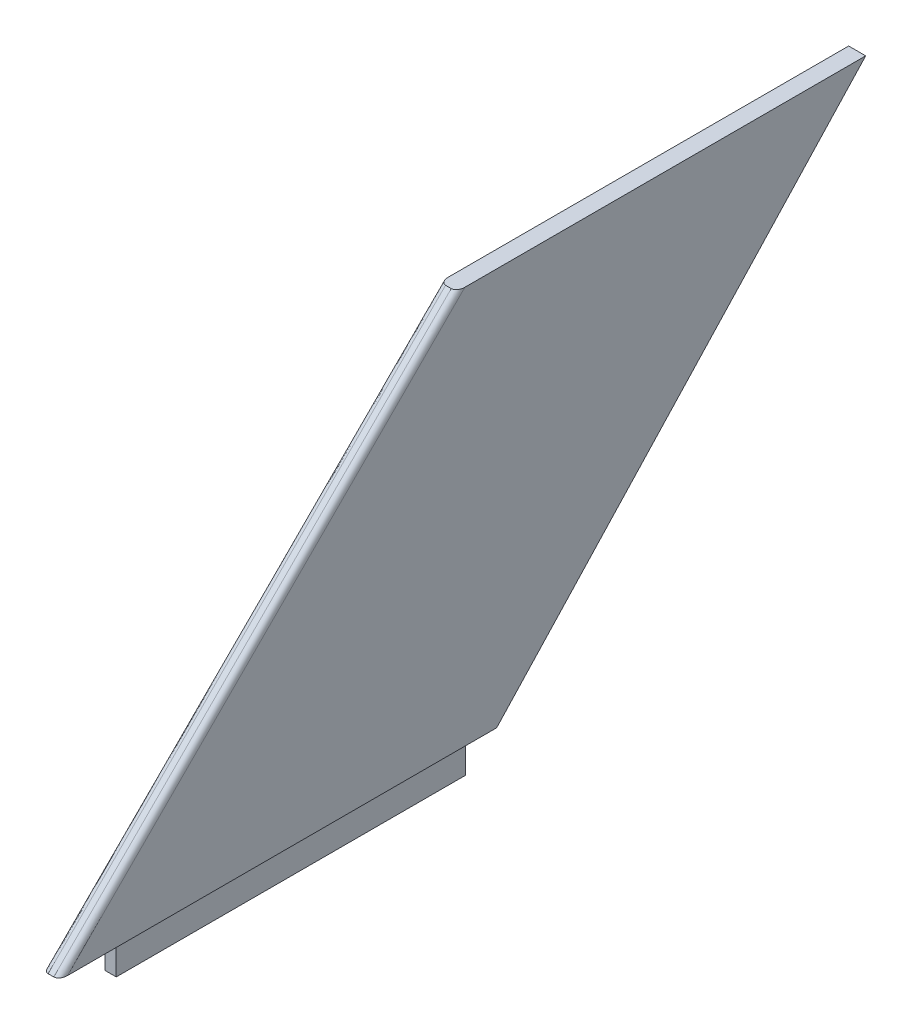
ISO-10303-21;
HEADER;
FILE_DESCRIPTION(('STEP AP214'),'2;1');
FILE_NAME('part.step','',(''),(''),'','','');
FILE_SCHEMA(('AUTOMOTIVE_DESIGN { 1 0 10303 214 1 1 1 1 }'));
ENDSEC;
DATA;
#1=APPLICATION_CONTEXT('core data for automotive mechanical design processes');
#2=APPLICATION_PROTOCOL_DEFINITION('international standard','automotive_design',2000,#1);
#3=PRODUCT_CONTEXT('',#1,'mechanical');
#4=PRODUCT('Part','Part','',(#3));
#5=PRODUCT_RELATED_PRODUCT_CATEGORY('part','',(#4));
#6=PRODUCT_DEFINITION_FORMATION('','',#4);
#7=PRODUCT_DEFINITION_CONTEXT('part definition',#1,'design');
#8=PRODUCT_DEFINITION('design','',#6,#7);
#9=PRODUCT_DEFINITION_SHAPE('','',#8);
#10=(LENGTH_UNIT() NAMED_UNIT(*) SI_UNIT(.MILLI.,.METRE.));
#11=(NAMED_UNIT(*) PLANE_ANGLE_UNIT() SI_UNIT($,.RADIAN.));
#12=(NAMED_UNIT(*) SI_UNIT($,.STERADIAN.) SOLID_ANGLE_UNIT());
#13=UNCERTAINTY_MEASURE_WITH_UNIT(LENGTH_MEASURE(1.E-05),#10,'distance_accuracy_value','');
#14=(GEOMETRIC_REPRESENTATION_CONTEXT(3) GLOBAL_UNCERTAINTY_ASSIGNED_CONTEXT((#13)) GLOBAL_UNIT_ASSIGNED_CONTEXT((#10,
#11,#12)) REPRESENTATION_CONTEXT('',''));
#15=CARTESIAN_POINT('',(0.,0.,0.));
#16=DIRECTION('',(0.,0.,1.));
#17=DIRECTION('',(1.,0.,0.));
#18=AXIS2_PLACEMENT_3D('',#15,#16,#17);
#19=CARTESIAN_POINT('',(-1.5,0.,0.));
#20=DIRECTION('',(0.,-1.,0.));
#21=DIRECTION('',(0.,0.,-1.));
#22=AXIS2_PLACEMENT_3D('',#19,#20,#21);
#23=PLANE('',#22);
#24=DIRECTION('',(1.,0.,0.));
#25=VECTOR('',#24,1.);
#26=CARTESIAN_POINT('',(-1.5,0.,0.));
#27=LINE('',#26,#25);
#28=CARTESIAN_POINT('',(-0.5,0.,0.));
#29=VERTEX_POINT('',#28);
#30=CARTESIAN_POINT('',(0.5,0.,0.));
#31=VERTEX_POINT('',#30);
#32=EDGE_CURVE('E199',#29,#31,#27,.T.);
#33=ORIENTED_EDGE('',*,*,#32,.F.);
#34=CARTESIAN_POINT('',(-0.5,0.,0.));
#35=CARTESIAN_POINT('',(-0.522432139271495,0.,4.28213383646253E-06));
#36=CARTESIAN_POINT('',(-0.544850417522464,0.,-0.00106838830824979));
#37=CARTESIAN_POINT('',(-0.589469498695578,0.,-0.00531757382415468));
#38=CARTESIAN_POINT('',(-0.611670458024248,0.,-0.00849244245681111));
#39=CARTESIAN_POINT('',(-0.677302890130983,0.,-0.0210191073333947));
#40=CARTESIAN_POINT('',(-0.720190850817826,0.,-0.0333750872333478));
#41=CARTESIAN_POINT('',(-0.803060570571731,0.,-0.0651407101604232));
#42=CARTESIAN_POINT('',(-0.843050014620296,0.,-0.0845308161155377));
#43=CARTESIAN_POINT('',(-0.91965411309202,0.,-0.129213754905584));
#44=CARTESIAN_POINT('',(-0.956260867990477,0.,-0.154519940458008));
#45=CARTESIAN_POINT('',(-1.03986481395865,0.,-0.221154334224486));
#46=CARTESIAN_POINT('',(-1.08500721102152,0.,-0.264806867317821));
#47=CARTESIAN_POINT('',(-1.16770625980553,0.,-0.358757906543464));
#48=CARTESIAN_POINT('',(-1.20524927142572,0.,-0.409068099544706));
#49=CARTESIAN_POINT('',(-1.28615525578395,0.,-0.534636397174698));
#50=CARTESIAN_POINT('',(-1.32618534137871,0.,-0.612036983353824));
#51=CARTESIAN_POINT('',(-1.39347016951837,0.,-0.772239896244851));
#52=CARTESIAN_POINT('',(-1.42069595083783,0.,-0.855053990513233));
#53=CARTESIAN_POINT('',(-1.46155171473557,0.,-1.01716352584462));
#54=CARTESIAN_POINT('',(-1.47606786899258,0.,-1.09623819380053));
#55=CARTESIAN_POINT('',(-1.49047540498184,0.,-1.21540194231432));
#56=CARTESIAN_POINT('',(-1.49405033485382,0.,-1.255081731874));
#57=CARTESIAN_POINT('',(-1.49881055742126,0.,-1.33457577636893));
#58=CARTESIAN_POINT('',(-1.49999638544386,0.,-1.37438999917843));
#59=CARTESIAN_POINT('',(-1.5,0.,-1.41421356237309));
#60=B_SPLINE_CURVE_WITH_KNOTS('',3,(#34,#35,#36,#37,#38,#39,#40,#41,#42,#43,#44,#45,#46,#47,#48,
#49,#50,#51,#52,#53,#54,#55,#56,#57,#58,#59),.UNSPECIFIED.,.F.,.F.,(4,2,2,2,2,2,2,2,2,2,2,2,4),
(0.,0.067244576243673,0.134436548746756,0.267559817204332,0.40031613576042,0.533375031357673,
0.720724586728295,0.908407489959711,1.16841947094215,1.42901676088485,1.66952818866819,
1.78898865955086,1.9084223598927),.UNSPECIFIED.);
#61=CARTESIAN_POINT('',(-1.5,0.,-1.4142135623731));
#62=VERTEX_POINT('',#61);
#63=EDGE_CURVE('E224',#29,#62,#60,.T.);
#64=ORIENTED_EDGE('',*,*,#63,.T.);
#65=DIRECTION('',(0.,0.,-1.));
#66=VECTOR('',#65,1.);
#67=CARTESIAN_POINT('',(-1.5,0.,0.));
#68=LINE('',#67,#66);
#69=CARTESIAN_POINT('',(-1.5,0.,-77.));
#70=VERTEX_POINT('',#69);
#71=EDGE_CURVE('E187',#62,#70,#68,.T.);
#72=ORIENTED_EDGE('',*,*,#71,.T.);
#73=DIRECTION('',(1.,0.,0.));
#74=VECTOR('',#73,1.);
#75=CARTESIAN_POINT('',(-1.5,0.,-77.));
#76=LINE('',#75,#74);
#77=CARTESIAN_POINT('',(1.5,0.,-77.));
#78=VERTEX_POINT('',#77);
#79=EDGE_CURVE('E196',#70,#78,#76,.T.);
#80=ORIENTED_EDGE('',*,*,#79,.T.);
#81=DIRECTION('',(0.,0.,-1.));
#82=VECTOR('',#81,1.);
#83=CARTESIAN_POINT('',(1.5,0.,0.));
#84=LINE('',#83,#82);
#85=CARTESIAN_POINT('',(1.5,0.,-1.41421356237303));
#86=VERTEX_POINT('',#85);
#87=EDGE_CURVE('E180',#86,#78,#84,.T.);
#88=ORIENTED_EDGE('',*,*,#87,.F.);
#89=CARTESIAN_POINT('',(1.5,0.,-1.41421356237303));
#90=CARTESIAN_POINT('',(1.49998931811678,0.,-1.36008942055353));
#91=CARTESIAN_POINT('',(1.49780214670249,0.,-1.30595833106146));
#92=CARTESIAN_POINT('',(1.48899288159112,0.,-1.19798293804061));
#93=CARTESIAN_POINT('',(1.48236454869224,0.,-1.14413914553681));
#94=CARTESIAN_POINT('',(1.46450331515178,0.,-1.03666828249923));
#95=CARTESIAN_POINT('',(1.45322582349473,0.,-0.983048536262566));
#96=CARTESIAN_POINT('',(1.42592038243902,0.,-0.877071264094583));
#97=CARTESIAN_POINT('',(1.40989564963751,0.,-0.824712909371777));
#98=CARTESIAN_POINT('',(1.36559251047797,0.,-0.701483886047915));
#99=CARTESIAN_POINT('',(1.3349735224152,0.,-0.631431633506232));
#100=CARTESIAN_POINT('',(1.26344708351159,0.,-0.496965120576499));
#101=CARTESIAN_POINT('',(1.22257552535248,0.,-0.43253222669168));
#102=CARTESIAN_POINT('',(1.14180100420178,0.,-0.327686963773389));
#103=CARTESIAN_POINT('',(1.10437888762883,0.,-0.285370885536894));
#104=CARTESIAN_POINT('',(1.02331294672859,0.,-0.207114827041283));
#105=CARTESIAN_POINT('',(0.979675171822121,0.,-0.171168722628371));
#106=CARTESIAN_POINT('',(0.895952373279108,0.,-0.11427387742319));
#107=CARTESIAN_POINT('',(0.856933362004908,0.,-0.0917623121030914));
#108=CARTESIAN_POINT('',(0.775749863928638,0.,-0.0534905849917523));
#109=CARTESIAN_POINT('',(0.733592580940936,0.,-0.0377154888027594));
#110=CARTESIAN_POINT('',(0.659443789427169,0.,-0.0173816524187676));
#111=CARTESIAN_POINT('',(0.627970422158805,0.,-0.0109090103185529));
#112=CARTESIAN_POINT('',(0.564343800800723,0.,-0.00219741707087628));
#113=CARTESIAN_POINT('',(0.532188691296722,0.,2.79015404234371E-05));
#114=CARTESIAN_POINT('',(0.5,0.,0.));
#115=B_SPLINE_CURVE_WITH_KNOTS('',3,(#89,#90,#91,#92,#93,#94,#95,#96,#97,#98,#99,#100,#101,#102,
#103,#104,#105,#106,#107,#108,#109,#110,#111,#112,#113,#114),.UNSPECIFIED.,.F.,.F.,(4,2,2,2,2,2,
2,2,2,2,2,2,4),(0.,0.162339146431749,0.324906835855208,0.489071424901014,0.653125034062499,
0.881702828961168,1.10949131114009,1.27839535454087,1.44713612042538,1.58175444802135,
1.71607276466407,1.8121961566969,1.908627558312),.UNSPECIFIED.);
#116=EDGE_CURVE('E214',#86,#31,#115,.T.);
#117=ORIENTED_EDGE('',*,*,#116,.T.);
#118=EDGE_LOOP('',(#33,#64,#72,#80,#88,#117));
#119=FACE_BOUND('',#118,.T.);
#120=DIRECTION('',(0.,0.,-1.));
#121=VECTOR('',#120,1.);
#122=CARTESIAN_POINT('',(-1.,0.,0.));
#123=LINE('',#122,#121);
#124=CARTESIAN_POINT('',(-1.,0.,-10.5));
#125=VERTEX_POINT('',#124);
#126=CARTESIAN_POINT('',(-1.,0.,-72.));
#127=VERTEX_POINT('',#126);
#128=EDGE_CURVE('E148',#125,#127,#123,.T.);
#129=ORIENTED_EDGE('',*,*,#128,.F.);
#130=DIRECTION('',(1.,0.,0.));
#131=VECTOR('',#130,1.);
#132=CARTESIAN_POINT('',(-1.,0.,-10.5));
#133=LINE('',#132,#131);
#134=CARTESIAN_POINT('',(1.,0.,-10.5));
#135=VERTEX_POINT('',#134);
#136=EDGE_CURVE('E172',#125,#135,#133,.T.);
#137=ORIENTED_EDGE('',*,*,#136,.T.);
#138=DIRECTION('',(0.,0.,-1.));
#139=VECTOR('',#138,1.);
#140=CARTESIAN_POINT('',(1.,0.,0.));
#141=LINE('',#140,#139);
#142=CARTESIAN_POINT('',(1.,0.,-72.));
#143=VERTEX_POINT('',#142);
#144=EDGE_CURVE('E156',#135,#143,#141,.T.);
#145=ORIENTED_EDGE('',*,*,#144,.T.);
#146=DIRECTION('',(1.,0.,0.));
#147=VECTOR('',#146,1.);
#148=CARTESIAN_POINT('',(-1.,0.,-72.));
#149=LINE('',#148,#147);
#150=EDGE_CURVE('E175',#127,#143,#149,.T.);
#151=ORIENTED_EDGE('',*,*,#150,.F.);
#152=EDGE_LOOP('',(#129,#137,#145,#151));
#153=FACE_BOUND('',#152,.T.);
#154=ADVANCED_FACE('F48',(#119,#153),#23,.T.);
#155=CARTESIAN_POINT('',(-1.5,70.,0.));
#156=DIRECTION('',(0.,1.,0.));
#157=DIRECTION('',(0.,0.,1.));
#158=AXIS2_PLACEMENT_3D('',#155,#156,#157);
#159=PLANE('',#158);
#160=DIRECTION('',(0.,0.,1.));
#161=VECTOR('',#160,1.);
#162=CARTESIAN_POINT('',(-1.5,70.,0.));
#163=LINE('',#162,#161);
#164=CARTESIAN_POINT('',(-1.5,70.,-142.));
#165=VERTEX_POINT('',#164);
#166=CARTESIAN_POINT('',(-1.5,70.,-71.4142135623731));
#167=VERTEX_POINT('',#166);
#168=EDGE_CURVE('E185',#165,#167,#163,.T.);
#169=ORIENTED_EDGE('',*,*,#168,.T.);
#170=CARTESIAN_POINT('',(-1.5,70.,-71.4142135623731));
#171=CARTESIAN_POINT('',(-1.49998931811679,70.,-71.3600894205536));
#172=CARTESIAN_POINT('',(-1.4978021467025,70.,-71.3059583310615));
#173=CARTESIAN_POINT('',(-1.48899288159112,70.,-71.1979829380406));
#174=CARTESIAN_POINT('',(-1.48236454869224,70.,-71.1441391455368));
#175=CARTESIAN_POINT('',(-1.46450331515178,70.,-71.0366682824992));
#176=CARTESIAN_POINT('',(-1.45322582349473,70.,-70.9830485362626));
#177=CARTESIAN_POINT('',(-1.42592038243902,70.,-70.8770712640946));
#178=CARTESIAN_POINT('',(-1.40989564963751,70.,-70.8247129093718));
#179=CARTESIAN_POINT('',(-1.36559251047796,70.,-70.7014838860479));
#180=CARTESIAN_POINT('',(-1.33497352241519,70.,-70.6314316335062));
#181=CARTESIAN_POINT('',(-1.26344708351159,70.,-70.4969651205765));
#182=CARTESIAN_POINT('',(-1.22257552535249,70.,-70.4325322266917));
#183=CARTESIAN_POINT('',(-1.14180100420179,70.,-70.3276869637734));
#184=CARTESIAN_POINT('',(-1.10437888762884,70.,-70.2853708855369));
#185=CARTESIAN_POINT('',(-1.0233129467286,70.,-70.2071148270413));
#186=CARTESIAN_POINT('',(-0.979675171822132,70.,-70.1711687226284));
#187=CARTESIAN_POINT('',(-0.895952373279123,70.,-70.1142738774232));
#188=CARTESIAN_POINT('',(-0.856933362004923,70.,-70.0917623121031));
#189=CARTESIAN_POINT('',(-0.775749863928658,70.,-70.0534905849918));
#190=CARTESIAN_POINT('',(-0.733592580940958,70.,-70.0377154888028));
#191=CARTESIAN_POINT('',(-0.659443789427191,70.,-70.0173816524188));
#192=CARTESIAN_POINT('',(-0.627970422158824,70.,-70.0109090103186));
#193=CARTESIAN_POINT('',(-0.564343800800734,70.,-70.0021974170709));
#194=CARTESIAN_POINT('',(-0.532188691296728,70.,-69.9999720984596));
#195=CARTESIAN_POINT('',(-0.5,70.,-70.));
#196=B_SPLINE_CURVE_WITH_KNOTS('',3,(#170,#171,#172,#173,#174,#175,#176,#177,#178,#179,#180,
#181,#182,#183,#184,#185,#186,#187,#188,#189,#190,#191,#192,#193,#194,#195),.UNSPECIFIED.,.F.,
.F.,(4,2,2,2,2,2,2,2,2,2,2,2,4),(0.,0.1623391464318,0.324906835855273,0.489071424901104,
0.653125034062607,0.881702828961259,1.10949131114016,1.27839535454095,1.44713612042545,
1.58175444802141,1.71607276466413,1.81219615669697,1.90862755831208),.UNSPECIFIED.);
#197=CARTESIAN_POINT('',(-0.5,70.,-70.));
#198=VERTEX_POINT('',#197);
#199=EDGE_CURVE('E62',#167,#198,#196,.T.);
#200=ORIENTED_EDGE('',*,*,#199,.T.);
#201=DIRECTION('',(1.,0.,0.));
#202=VECTOR('',#201,1.);
#203=CARTESIAN_POINT('',(-1.5,70.,-70.));
#204=LINE('',#203,#202);
#205=CARTESIAN_POINT('',(0.5,70.,-70.));
#206=VERTEX_POINT('',#205);
#207=EDGE_CURVE('E192',#198,#206,#204,.T.);
#208=ORIENTED_EDGE('',*,*,#207,.T.);
#209=CARTESIAN_POINT('',(0.5,70.,-70.));
#210=CARTESIAN_POINT('',(0.522432139271495,70.,-69.9999957178662));
#211=CARTESIAN_POINT('',(0.544850417522463,70.,-70.0010683883083));
#212=CARTESIAN_POINT('',(0.589469498695574,70.,-70.0053175738242));
#213=CARTESIAN_POINT('',(0.611670458024243,70.,-70.0084924424568));
#214=CARTESIAN_POINT('',(0.677302890130977,70.,-70.0210191073334));
#215=CARTESIAN_POINT('',(0.720190850817822,70.,-70.0333750872334));
#216=CARTESIAN_POINT('',(0.803060570571727,70.,-70.0651407101604));
#217=CARTESIAN_POINT('',(0.843050014620291,70.,-70.0845308161155));
#218=CARTESIAN_POINT('',(0.919654113092015,70.,-70.1292137549056));
#219=CARTESIAN_POINT('',(0.956260867990473,69.9999999999999,-70.154519940458));
#220=CARTESIAN_POINT('',(1.03986481395865,69.9999999999999,-70.2211543342245));
#221=CARTESIAN_POINT('',(1.08500721102152,70.,-70.2648068673178));
#222=CARTESIAN_POINT('',(1.16770625980552,70.,-70.3587579065435));
#223=CARTESIAN_POINT('',(1.20524927142571,70.,-70.4090680995447));
#224=CARTESIAN_POINT('',(1.28615525578392,70.,-70.5346363971747));
#225=CARTESIAN_POINT('',(1.3261853413787,70.,-70.6120369833538));
#226=CARTESIAN_POINT('',(1.39347016951836,70.,-70.7722398962448));
#227=CARTESIAN_POINT('',(1.42069595083782,70.,-70.8550539905132));
#228=CARTESIAN_POINT('',(1.46155171473556,70.,-71.0171635258446));
#229=CARTESIAN_POINT('',(1.47606786899257,70.,-71.0962381938005));
#230=CARTESIAN_POINT('',(1.49047540498183,70.,-71.2154019423143));
#231=CARTESIAN_POINT('',(1.49405033485382,70.,-71.255081731874));
#232=CARTESIAN_POINT('',(1.49881055742126,70.,-71.3345757763689));
#233=CARTESIAN_POINT('',(1.49999638544386,70.,-71.3743899991784));
#234=CARTESIAN_POINT('',(1.5,70.,-71.414213562373));
#235=B_SPLINE_CURVE_WITH_KNOTS('',3,(#209,#210,#211,#212,#213,#214,#215,#216,#217,#218,#219,
#220,#221,#222,#223,#224,#225,#226,#227,#228,#229,#230,#231,#232,#233,#234),.UNSPECIFIED.,.F.,
.F.,(4,2,2,2,2,2,2,2,2,2,2,2,4),(0.,0.0672445762436697,0.134436548746751,0.267559817204328,
0.400316135760408,0.533375031357666,0.720724586728295,0.908407489959706,1.16841947094214,
1.4290167608848,1.66952818866814,1.78898865955081,1.90842235989265),.UNSPECIFIED.);
#236=CARTESIAN_POINT('',(1.5,70.,-71.4142135623731));
#237=VERTEX_POINT('',#236);
#238=EDGE_CURVE('E69',#206,#237,#235,.T.);
#239=ORIENTED_EDGE('',*,*,#238,.T.);
#240=DIRECTION('',(0.,0.,1.));
#241=VECTOR('',#240,1.);
#242=CARTESIAN_POINT('',(1.5,70.,0.));
#243=LINE('',#242,#241);
#244=CARTESIAN_POINT('',(1.5,70.,-142.));
#245=VERTEX_POINT('',#244);
#246=EDGE_CURVE('E174',#245,#237,#243,.T.);
#247=ORIENTED_EDGE('',*,*,#246,.F.);
#248=DIRECTION('',(1.,0.,0.));
#249=VECTOR('',#248,1.);
#250=CARTESIAN_POINT('',(-1.5,70.,-142.));
#251=LINE('',#250,#249);
#252=EDGE_CURVE('E193',#165,#245,#251,.T.);
#253=ORIENTED_EDGE('',*,*,#252,.F.);
#254=EDGE_LOOP('',(#169,#200,#208,#239,#247,#253));
#255=FACE_BOUND('',#254,.T.);
#256=ADVANCED_FACE('F234',(#255),#159,.T.);
#257=CARTESIAN_POINT('',(-1.5,-38.3945205479452,-41.3479452054794));
#258=DIRECTION('',(0.,-0.680451099367278,-0.732793491626299));
#259=DIRECTION('',(0.,0.732793491626299,-0.680451099367278));
#260=AXIS2_PLACEMENT_3D('',#257,#258,#259);
#261=PLANE('',#260);
#262=ORIENTED_EDGE('',*,*,#252,.T.);
#263=DIRECTION('',(0.,0.732793491626299,-0.680451099367278));
#264=VECTOR('',#263,1.);
#265=CARTESIAN_POINT('',(1.5,-38.3945205479452,-41.3479452054794));
#266=LINE('',#265,#264);
#267=EDGE_CURVE('E182',#78,#245,#266,.T.);
#268=ORIENTED_EDGE('',*,*,#267,.F.);
#269=ORIENTED_EDGE('',*,*,#79,.F.);
#270=DIRECTION('',(0.,0.732793491626299,-0.680451099367278));
#271=VECTOR('',#270,1.);
#272=CARTESIAN_POINT('',(-1.5,-38.3945205479452,-41.3479452054794));
#273=LINE('',#272,#271);
#274=EDGE_CURVE('E189',#70,#165,#273,.T.);
#275=ORIENTED_EDGE('',*,*,#274,.T.);
#276=EDGE_LOOP('',(#262,#268,#269,#275));
#277=FACE_BOUND('',#276,.T.);
#278=ADVANCED_FACE('F236',(#277),#261,.T.);
#279=CARTESIAN_POINT('',(-1.5,0.,0.));
#280=DIRECTION('',(0.,0.707106781186548,0.707106781186547));
#281=DIRECTION('',(0.,-0.707106781186547,0.707106781186548));
#282=AXIS2_PLACEMENT_3D('',#279,#280,#281);
#283=PLANE('',#282);
#284=ORIENTED_EDGE('',*,*,#207,.F.);
#285=CARTESIAN_POINT('',(-0.5,212.12132034356,-212.12132034356));
#286=CARTESIAN_POINT('',(-0.5,164.747546895706,-164.747546895707));
#287=CARTESIAN_POINT('',(-0.5,117.373773447853,-117.373773447853));
#288=CARTESIAN_POINT('',(-0.5,70.,-70.));
#289=CARTESIAN_POINT('',(-0.5,46.6666666666667,-46.6666666666667));
#290=CARTESIAN_POINT('',(-0.5,23.3333333333333,-23.3333333333334));
#291=CARTESIAN_POINT('',(-0.5,0.,0.));
#292=CARTESIAN_POINT('',(-0.5,-47.1380711874577,47.1380711874577));
#293=CARTESIAN_POINT('',(-0.5,-94.2761423749154,94.2761423749154));
#294=CARTESIAN_POINT('',(-0.5,-141.414213562373,141.414213562373));
#295=(BOUNDED_CURVE() B_SPLINE_CURVE(3,(#285,#286,#287,#288,#289,#290,#291,#292,#293,#294),
.UNSPECIFIED.,.F.,.F.) B_SPLINE_CURVE_WITH_KNOTS((4,3,3,4),(-0.29998484809835,
-0.0989949493661167,0.,0.199989898732233),
.UNSPECIFIED.) CURVE() GEOMETRIC_REPRESENTATION_ITEM() RATIONAL_B_SPLINE_CURVE((1.,1.,1.,1.,1.,
1.,1.,1.,1.,1.)) REPRESENTATION_ITEM(''));
#296=EDGE_CURVE('E206',#198,#29,#295,.T.);
#297=ORIENTED_EDGE('',*,*,#296,.T.);
#298=ORIENTED_EDGE('',*,*,#32,.T.);
#299=CARTESIAN_POINT('',(0.5,212.12132034356,-212.12132034356));
#300=CARTESIAN_POINT('',(0.5,164.747546895706,-164.747546895707));
#301=CARTESIAN_POINT('',(0.5,117.373773447853,-117.373773447853));
#302=CARTESIAN_POINT('',(0.5,70.,-70.));
#303=CARTESIAN_POINT('',(0.5,46.6666666666667,-46.6666666666667));
#304=CARTESIAN_POINT('',(0.5,23.3333333333333,-23.3333333333334));
#305=CARTESIAN_POINT('',(0.5,0.,0.));
#306=CARTESIAN_POINT('',(0.5,-47.1380711874577,47.1380711874577));
#307=CARTESIAN_POINT('',(0.5,-94.2761423749154,94.2761423749154));
#308=CARTESIAN_POINT('',(0.5,-141.414213562373,141.414213562373));
#309=(BOUNDED_CURVE() B_SPLINE_CURVE(3,(#299,#300,#301,#302,#303,#304,#305,#306,#307,#308),
.UNSPECIFIED.,.F.,.F.) B_SPLINE_CURVE_WITH_KNOTS((4,3,3,4),(-0.29998484809835,
-0.0989949493661167,0.,0.199989898732233),
.UNSPECIFIED.) CURVE() GEOMETRIC_REPRESENTATION_ITEM() RATIONAL_B_SPLINE_CURVE((1.,1.,1.,1.,1.,
1.,1.,1.,1.,1.)) REPRESENTATION_ITEM(''));
#310=EDGE_CURVE('E195',#31,#206,#309,.F.);
#311=ORIENTED_EDGE('',*,*,#310,.T.);
#312=EDGE_LOOP('',(#284,#297,#298,#311));
#313=FACE_BOUND('',#312,.T.);
#314=ADVANCED_FACE('F238',(#313),#283,.T.);
#315=CARTESIAN_POINT('',(-1.5,0.,0.));
#316=DIRECTION('',(1.,0.,0.));
#317=DIRECTION('',(0.,0.,-1.));
#318=AXIS2_PLACEMENT_3D('',#315,#316,#317);
#319=PLANE('',#318);
#320=ORIENTED_EDGE('',*,*,#71,.F.);
#321=CARTESIAN_POINT('',(-1.5,211.414213562373,-212.828427124746));
#322=CARTESIAN_POINT('',(-1.5,164.04044011452,-165.454653676893));
#323=CARTESIAN_POINT('',(-1.5,116.666666666667,-118.08088022904));
#324=CARTESIAN_POINT('',(-1.5,69.2928932188134,-70.7071067811866));
#325=CARTESIAN_POINT('',(-1.5,45.9595598854801,-47.3737734478532));
#326=CARTESIAN_POINT('',(-1.5,22.6262265521468,-24.0404401145199));
#327=CARTESIAN_POINT('',(-1.5,-0.707106781186538,-0.707106781186561));
#328=CARTESIAN_POINT('',(-1.5,-47.8451779686442,46.4309644062712));
#329=CARTESIAN_POINT('',(-1.5,-94.9832491561019,93.5690355937289));
#330=CARTESIAN_POINT('',(-1.5,-142.12132034356,140.707106781187));
#331=(BOUNDED_CURVE() B_SPLINE_CURVE(3,(#321,#322,#323,#324,#325,#326,#327,#328,#329,#330),
.UNSPECIFIED.,.F.,.F.) B_SPLINE_CURVE_WITH_KNOTS((4,3,3,4),(-0.29998484809835,
-0.0989949493661167,0.,0.199989898732233),
.UNSPECIFIED.) CURVE() GEOMETRIC_REPRESENTATION_ITEM() RATIONAL_B_SPLINE_CURVE((1.,1.,1.,1.,1.,
1.,1.,1.,1.,1.)) REPRESENTATION_ITEM(''));
#332=EDGE_CURVE('E77',#62,#167,#331,.F.);
#333=ORIENTED_EDGE('',*,*,#332,.T.);
#334=ORIENTED_EDGE('',*,*,#168,.F.);
#335=ORIENTED_EDGE('',*,*,#274,.F.);
#336=EDGE_LOOP('',(#320,#333,#334,#335));
#337=FACE_BOUND('',#336,.T.);
#338=ADVANCED_FACE('F242',(#337),#319,.F.);
#339=CARTESIAN_POINT('',(1.5,0.,0.));
#340=DIRECTION('',(1.,0.,0.));
#341=DIRECTION('',(0.,0.,-1.));
#342=AXIS2_PLACEMENT_3D('',#339,#340,#341);
#343=PLANE('',#342);
#344=ORIENTED_EDGE('',*,*,#246,.T.);
#345=CARTESIAN_POINT('',(1.5,211.414213562373,-212.828427124746));
#346=CARTESIAN_POINT('',(1.5,164.04044011452,-165.454653676893));
#347=CARTESIAN_POINT('',(1.5,116.666666666667,-118.08088022904));
#348=CARTESIAN_POINT('',(1.5,69.2928932188134,-70.7071067811866));
#349=CARTESIAN_POINT('',(1.5,45.9595598854801,-47.3737734478532));
#350=CARTESIAN_POINT('',(1.5,22.6262265521468,-24.0404401145199));
#351=CARTESIAN_POINT('',(1.5,-0.707106781186538,-0.707106781186561));
#352=CARTESIAN_POINT('',(1.5,-47.8451779686442,46.4309644062712));
#353=CARTESIAN_POINT('',(1.5,-94.9832491561019,93.5690355937289));
#354=CARTESIAN_POINT('',(1.5,-142.12132034356,140.707106781187));
#355=(BOUNDED_CURVE() B_SPLINE_CURVE(3,(#345,#346,#347,#348,#349,#350,#351,#352,#353,#354),
.UNSPECIFIED.,.F.,.F.) B_SPLINE_CURVE_WITH_KNOTS((4,3,3,4),(-0.29998484809835,
-0.0989949493661167,0.,0.199989898732233),
.UNSPECIFIED.) CURVE() GEOMETRIC_REPRESENTATION_ITEM() RATIONAL_B_SPLINE_CURVE((1.,1.,1.,1.,1.,
1.,1.,1.,1.,1.)) REPRESENTATION_ITEM(''));
#356=EDGE_CURVE('E12',#237,#86,#355,.T.);
#357=ORIENTED_EDGE('',*,*,#356,.T.);
#358=ORIENTED_EDGE('',*,*,#87,.T.);
#359=ORIENTED_EDGE('',*,*,#267,.T.);
#360=EDGE_LOOP('',(#344,#357,#358,#359));
#361=FACE_BOUND('',#360,.T.);
#362=ADVANCED_FACE('F279',(#361),#343,.T.);
#363=CARTESIAN_POINT('',(-1.,0.,-10.5));
#364=DIRECTION('',(0.,0.,-1.));
#365=DIRECTION('',(-1.,0.,0.));
#366=AXIS2_PLACEMENT_3D('',#363,#364,#365);
#367=PLANE('',#366);
#368=DIRECTION('',(1.,0.,0.));
#369=VECTOR('',#368,1.);
#370=CARTESIAN_POINT('',(-1.,-5.00000000000001,-10.5));
#371=LINE('',#370,#369);
#372=CARTESIAN_POINT('',(-1.,-5.00000000000001,-10.5));
#373=VERTEX_POINT('',#372);
#374=CARTESIAN_POINT('',(1.,-5.00000000000001,-10.5));
#375=VERTEX_POINT('',#374);
#376=EDGE_CURVE('E136',#373,#375,#371,.T.);
#377=ORIENTED_EDGE('',*,*,#376,.T.);
#378=DIRECTION('',(0.,1.,0.));
#379=VECTOR('',#378,1.);
#380=CARTESIAN_POINT('',(1.,0.,-10.5));
#381=LINE('',#380,#379);
#382=EDGE_CURVE('E140',#375,#135,#381,.T.);
#383=ORIENTED_EDGE('',*,*,#382,.T.);
#384=ORIENTED_EDGE('',*,*,#136,.F.);
#385=DIRECTION('',(0.,1.,0.));
#386=VECTOR('',#385,1.);
#387=CARTESIAN_POINT('',(-1.,0.,-10.5));
#388=LINE('',#387,#386);
#389=EDGE_CURVE('E143',#373,#125,#388,.T.);
#390=ORIENTED_EDGE('',*,*,#389,.F.);
#391=EDGE_LOOP('',(#377,#383,#384,#390));
#392=FACE_BOUND('',#391,.T.);
#393=ADVANCED_FACE('F138',(#392),#367,.F.);
#394=CARTESIAN_POINT('',(-1.,0.,-72.));
#395=DIRECTION('',(0.,0.,1.));
#396=DIRECTION('',(1.,0.,0.));
#397=AXIS2_PLACEMENT_3D('',#394,#395,#396);
#398=PLANE('',#397);
#399=ORIENTED_EDGE('',*,*,#150,.T.);
#400=DIRECTION('',(0.,-1.,0.));
#401=VECTOR('',#400,1.);
#402=CARTESIAN_POINT('',(1.,0.,-72.));
#403=LINE('',#402,#401);
#404=CARTESIAN_POINT('',(1.,-5.,-72.));
#405=VERTEX_POINT('',#404);
#406=EDGE_CURVE('E160',#143,#405,#403,.T.);
#407=ORIENTED_EDGE('',*,*,#406,.T.);
#408=DIRECTION('',(1.,0.,0.));
#409=VECTOR('',#408,1.);
#410=CARTESIAN_POINT('',(-1.,-5.,-72.));
#411=LINE('',#410,#409);
#412=CARTESIAN_POINT('',(-1.,-5.,-72.));
#413=VERTEX_POINT('',#412);
#414=EDGE_CURVE('E147',#413,#405,#411,.T.);
#415=ORIENTED_EDGE('',*,*,#414,.F.);
#416=DIRECTION('',(0.,-1.,0.));
#417=VECTOR('',#416,1.);
#418=CARTESIAN_POINT('',(-1.,0.,-72.));
#419=LINE('',#418,#417);
#420=EDGE_CURVE('E168',#127,#413,#419,.T.);
#421=ORIENTED_EDGE('',*,*,#420,.F.);
#422=EDGE_LOOP('',(#399,#407,#415,#421));
#423=FACE_BOUND('',#422,.T.);
#424=ADVANCED_FACE('F294',(#423),#398,.F.);
#425=CARTESIAN_POINT('',(-1.,-5.00000000000001,0.));
#426=DIRECTION('',(0.,1.,0.));
#427=DIRECTION('',(0.,0.,1.));
#428=AXIS2_PLACEMENT_3D('',#425,#426,#427);
#429=PLANE('',#428);
#430=ORIENTED_EDGE('',*,*,#414,.T.);
#431=DIRECTION('',(0.,0.,1.));
#432=VECTOR('',#431,1.);
#433=CARTESIAN_POINT('',(1.,-5.00000000000001,0.));
#434=LINE('',#433,#432);
#435=EDGE_CURVE('E154',#405,#375,#434,.T.);
#436=ORIENTED_EDGE('',*,*,#435,.T.);
#437=ORIENTED_EDGE('',*,*,#376,.F.);
#438=DIRECTION('',(0.,0.,1.));
#439=VECTOR('',#438,1.);
#440=CARTESIAN_POINT('',(-1.,-5.00000000000001,0.));
#441=LINE('',#440,#439);
#442=EDGE_CURVE('E166',#413,#373,#441,.T.);
#443=ORIENTED_EDGE('',*,*,#442,.F.);
#444=EDGE_LOOP('',(#430,#436,#437,#443));
#445=FACE_BOUND('',#444,.T.);
#446=ADVANCED_FACE('F158',(#445),#429,.F.);
#447=CARTESIAN_POINT('',(-1.,0.,0.));
#448=DIRECTION('',(1.,0.,0.));
#449=DIRECTION('',(0.,0.,-1.));
#450=AXIS2_PLACEMENT_3D('',#447,#448,#449);
#451=PLANE('',#450);
#452=ORIENTED_EDGE('',*,*,#389,.T.);
#453=ORIENTED_EDGE('',*,*,#128,.T.);
#454=ORIENTED_EDGE('',*,*,#420,.T.);
#455=ORIENTED_EDGE('',*,*,#442,.T.);
#456=EDGE_LOOP('',(#452,#453,#454,#455));
#457=FACE_BOUND('',#456,.T.);
#458=ADVANCED_FACE('F311',(#457),#451,.F.);
#459=CARTESIAN_POINT('',(1.,0.,0.));
#460=DIRECTION('',(1.,0.,0.));
#461=DIRECTION('',(0.,0.,-1.));
#462=AXIS2_PLACEMENT_3D('',#459,#460,#461);
#463=PLANE('',#462);
#464=ORIENTED_EDGE('',*,*,#382,.F.);
#465=ORIENTED_EDGE('',*,*,#435,.F.);
#466=ORIENTED_EDGE('',*,*,#406,.F.);
#467=ORIENTED_EDGE('',*,*,#144,.F.);
#468=EDGE_LOOP('',(#464,#465,#466,#467));
#469=FACE_BOUND('',#468,.T.);
#470=ADVANCED_FACE('F152',(#469),#463,.T.);
#471=CARTESIAN_POINT('',(-0.5,85.4424678343858,-85.4424678343859));
#472=CARTESIAN_POINT('',(-0.5,80.2949785562572,-80.2949785562573));
#473=CARTESIAN_POINT('',(-0.5,75.1474892781286,-75.1474892781287));
#474=CARTESIAN_POINT('',(-0.5,70.,-70.));
#475=CARTESIAN_POINT('',(-0.5,46.6666666666667,-46.6666666666667));
#476=CARTESIAN_POINT('',(-0.5,23.3333333333333,-23.3333333333334));
#477=CARTESIAN_POINT('',(-0.5,0.,0.));
#478=CARTESIAN_POINT('',(-0.5,-4.9117870177331,4.9117870177331));
#479=CARTESIAN_POINT('',(-0.5,-9.82357403546621,9.82357403546621));
#480=CARTESIAN_POINT('',(-0.5,-14.7353610531993,14.7353610531993));
#481=CARTESIAN_POINT('',(-1.5,85.4424678343858,-85.4424678343859));
#482=CARTESIAN_POINT('',(-1.5,80.2949785562572,-80.2949785562573));
#483=CARTESIAN_POINT('',(-1.5,75.1474892781286,-75.1474892781287));
#484=CARTESIAN_POINT('',(-1.5,70.,-70.));
#485=CARTESIAN_POINT('',(-1.5,46.6666666666667,-46.6666666666667));
#486=CARTESIAN_POINT('',(-1.5,23.3333333333333,-23.3333333333334));
#487=CARTESIAN_POINT('',(-1.5,0.,0.));
#488=CARTESIAN_POINT('',(-1.5,-4.9117870177331,4.9117870177331));
#489=CARTESIAN_POINT('',(-1.5,-9.82357403546621,9.82357403546621));
#490=CARTESIAN_POINT('',(-1.5,-14.7353610531993,14.7353610531993));
#491=CARTESIAN_POINT('',(-1.5,84.7353610531993,-86.1495746155724));
#492=CARTESIAN_POINT('',(-1.5,79.5878717750707,-81.0020853374438));
#493=CARTESIAN_POINT('',(-1.5,74.440382496942,-75.8545960593152));
#494=CARTESIAN_POINT('',(-1.5,69.2928932188134,-70.7071067811866));
#495=CARTESIAN_POINT('',(-1.5,45.9595598854801,-47.3737734478532));
#496=CARTESIAN_POINT('',(-1.5,22.6262265521468,-24.0404401145199));
#497=CARTESIAN_POINT('',(-1.5,-0.707106781186538,-0.707106781186561));
#498=CARTESIAN_POINT('',(-1.5,-5.61889379891965,4.20468023654655));
#499=CARTESIAN_POINT('',(-1.5,-10.5306808166528,9.11646725427966));
#500=CARTESIAN_POINT('',(-1.5,-15.4424678343859,14.0282542720128));
#501=(BOUNDED_SURFACE() B_SPLINE_SURFACE(2,3,((#471,#472,#473,#474,#475,#476,#477,#478,#479,
#480),(#481,#482,#483,#484,#485,#486,#487,#488,#489,#490),(#491,#492,#493,#494,#495,#496,#497,
#498,#499,#500)),.UNSPECIFIED.,.F.,.F.,.F.) B_SPLINE_SURFACE_WITH_KNOTS((3,3),(4,3,3,4),(0.,1.),
(-0.120833896814015,-0.0989949493661167,0.,0.0208389474478988),
.UNSPECIFIED.) GEOMETRIC_REPRESENTATION_ITEM() RATIONAL_B_SPLINE_SURFACE(((1.,1.,1.,1.,1.,1.,1.,
1.,1.,1.),(0.707106781186548,0.707106781186548,0.707106781186548,0.707106781186548,
0.707106781186548,0.707106781186548,0.707106781186548,0.707106781186548,0.707106781186548,
0.707106781186548),(1.,1.,1.,1.,1.,1.,1.,1.,1.,1.))) REPRESENTATION_ITEM('') SURFACE());
#502=ORIENTED_EDGE('',*,*,#199,.F.);
#503=ORIENTED_EDGE('',*,*,#332,.F.);
#504=ORIENTED_EDGE('',*,*,#63,.F.);
#505=ORIENTED_EDGE('',*,*,#296,.F.);
#506=EDGE_LOOP('',(#502,#503,#504,#505));
#507=FACE_BOUND('',#506,.T.);
#508=ADVANCED_FACE('F247',(#507),#501,.T.);
#509=CARTESIAN_POINT('',(1.5,84.7353610531992,-86.1495746155724));
#510=CARTESIAN_POINT('',(1.5,79.5878717750706,-81.0020853374438));
#511=CARTESIAN_POINT('',(1.5,74.440382496942,-75.8545960593152));
#512=CARTESIAN_POINT('',(1.5,69.2928932188134,-70.7071067811866));
#513=CARTESIAN_POINT('',(1.5,45.9595598854801,-47.3737734478532));
#514=CARTESIAN_POINT('',(1.5,22.6262265521468,-24.0404401145199));
#515=CARTESIAN_POINT('',(1.5,-0.707106781186538,-0.707106781186561));
#516=CARTESIAN_POINT('',(1.5,-5.61889379891965,4.20468023654655));
#517=CARTESIAN_POINT('',(1.5,-10.5306808166528,9.11646725427966));
#518=CARTESIAN_POINT('',(1.5,-15.4424678343859,14.0282542720128));
#519=CARTESIAN_POINT('',(1.5,85.4424678343858,-85.4424678343858));
#520=CARTESIAN_POINT('',(1.5,80.2949785562572,-80.2949785562572));
#521=CARTESIAN_POINT('',(1.5,75.1474892781286,-75.1474892781286));
#522=CARTESIAN_POINT('',(1.5,70.,-70.));
#523=CARTESIAN_POINT('',(1.5,46.6666666666667,-46.6666666666667));
#524=CARTESIAN_POINT('',(1.5,23.3333333333333,-23.3333333333334));
#525=CARTESIAN_POINT('',(1.5,0.,0.));
#526=CARTESIAN_POINT('',(1.5,-4.9117870177331,4.9117870177331));
#527=CARTESIAN_POINT('',(1.5,-9.8235740354662,9.8235740354662));
#528=CARTESIAN_POINT('',(1.5,-14.7353610531993,14.7353610531993));
#529=CARTESIAN_POINT('',(0.5,85.4424678343858,-85.4424678343858));
#530=CARTESIAN_POINT('',(0.5,80.2949785562572,-80.2949785562572));
#531=CARTESIAN_POINT('',(0.5,75.1474892781286,-75.1474892781286));
#532=CARTESIAN_POINT('',(0.5,70.,-70.));
#533=CARTESIAN_POINT('',(0.5,46.6666666666667,-46.6666666666667));
#534=CARTESIAN_POINT('',(0.5,23.3333333333333,-23.3333333333334));
#535=CARTESIAN_POINT('',(0.5,0.,0.));
#536=CARTESIAN_POINT('',(0.5,-4.9117870177331,4.9117870177331));
#537=CARTESIAN_POINT('',(0.5,-9.8235740354662,9.82357403546621));
#538=CARTESIAN_POINT('',(0.5,-14.7353610531993,14.7353610531993));
#539=(BOUNDED_SURFACE() B_SPLINE_SURFACE(2,3,((#509,#510,#511,#512,#513,#514,#515,#516,#517,
#518),(#519,#520,#521,#522,#523,#524,#525,#526,#527,#528),(#529,#530,#531,#532,#533,#534,#535,
#536,#537,#538)),.UNSPECIFIED.,.F.,.F.,.F.) B_SPLINE_SURFACE_WITH_KNOTS((3,3),(4,3,3,4),(0.,1.),
(-0.120833896814015,-0.0989949493661167,0.,0.0208389474478988),
.UNSPECIFIED.) GEOMETRIC_REPRESENTATION_ITEM() RATIONAL_B_SPLINE_SURFACE(((1.,1.,1.,1.,1.,1.,1.,
1.,1.,1.),(0.707106781186548,0.707106781186548,0.707106781186548,0.707106781186548,
0.707106781186548,0.707106781186548,0.707106781186548,0.707106781186548,0.707106781186548,
0.707106781186548),(1.,1.,1.,1.,1.,1.,1.,1.,1.,1.))) REPRESENTATION_ITEM('') SURFACE());
#540=ORIENTED_EDGE('',*,*,#238,.F.);
#541=ORIENTED_EDGE('',*,*,#310,.F.);
#542=ORIENTED_EDGE('',*,*,#116,.F.);
#543=ORIENTED_EDGE('',*,*,#356,.F.);
#544=EDGE_LOOP('',(#540,#541,#542,#543));
#545=FACE_BOUND('',#544,.T.);
#546=ADVANCED_FACE('F51',(#545),#539,.T.);
#547=CLOSED_SHELL('',(#154,#256,#278,#314,#338,#362,#393,#424,#446,#458,#470,#508,#546));
#548=MANIFOLD_SOLID_BREP('B2',#547);
#549=ADVANCED_BREP_SHAPE_REPRESENTATION('',(#18,#548),#14);
#550=SHAPE_DEFINITION_REPRESENTATION(#9,#549);
ENDSEC;
END-ISO-10303-21;
